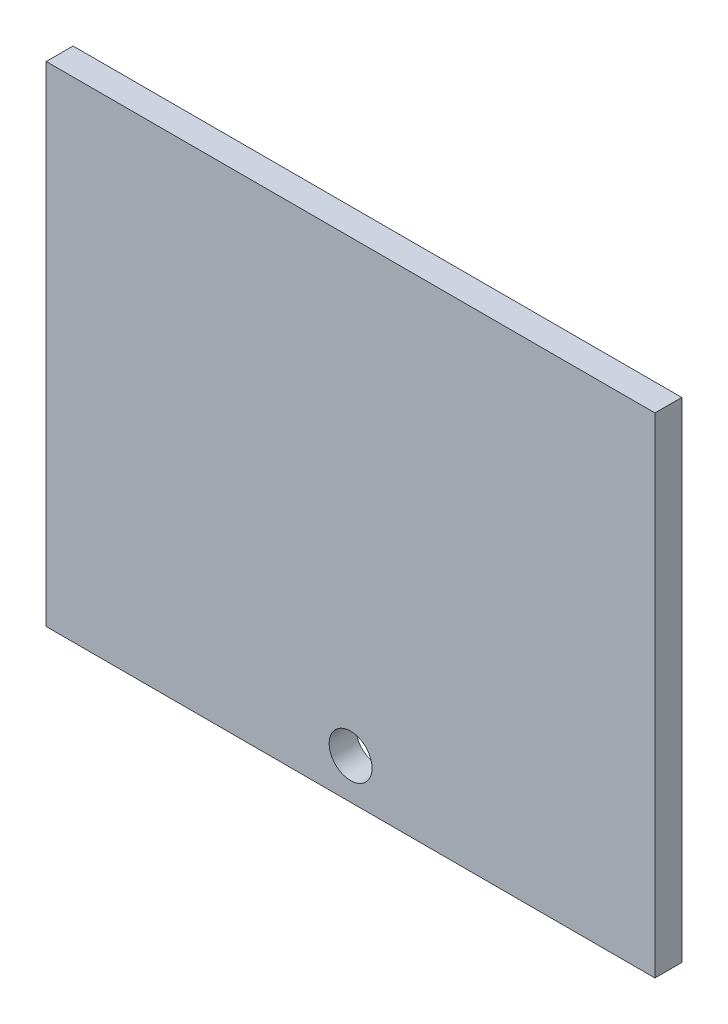
ISO-10303-21;
HEADER;
FILE_DESCRIPTION(('STEP AP214'),'2;1');
FILE_NAME('part.step','',(''),(''),'','','');
FILE_SCHEMA(('AUTOMOTIVE_DESIGN { 1 0 10303 214 1 1 1 1 }'));
ENDSEC;
DATA;
#1=APPLICATION_CONTEXT('core data for automotive mechanical design processes');
#2=APPLICATION_PROTOCOL_DEFINITION('international standard','automotive_design',2000,#1);
#3=PRODUCT_CONTEXT('',#1,'mechanical');
#4=PRODUCT('Part','Part','',(#3));
#5=PRODUCT_RELATED_PRODUCT_CATEGORY('part','',(#4));
#6=PRODUCT_DEFINITION_FORMATION('','',#4);
#7=PRODUCT_DEFINITION_CONTEXT('part definition',#1,'design');
#8=PRODUCT_DEFINITION('design','',#6,#7);
#9=PRODUCT_DEFINITION_SHAPE('','',#8);
#10=(LENGTH_UNIT() NAMED_UNIT(*) SI_UNIT(.MILLI.,.METRE.));
#11=(NAMED_UNIT(*) PLANE_ANGLE_UNIT() SI_UNIT($,.RADIAN.));
#12=(NAMED_UNIT(*) SI_UNIT($,.STERADIAN.) SOLID_ANGLE_UNIT());
#13=UNCERTAINTY_MEASURE_WITH_UNIT(LENGTH_MEASURE(1.E-05),#10,'distance_accuracy_value','');
#14=(GEOMETRIC_REPRESENTATION_CONTEXT(3) GLOBAL_UNCERTAINTY_ASSIGNED_CONTEXT((#13)) GLOBAL_UNIT_ASSIGNED_CONTEXT((#10,
#11,#12)) REPRESENTATION_CONTEXT('',''));
#15=CARTESIAN_POINT('',(0.,0.,0.));
#16=DIRECTION('',(0.,0.,1.));
#17=DIRECTION('',(1.,0.,0.));
#18=AXIS2_PLACEMENT_3D('',#15,#16,#17);
#19=CARTESIAN_POINT('',(-72.4410358565737,43.6116633484172,2.));
#20=DIRECTION('',(1.,0.,0.));
#21=DIRECTION('',(0.,0.,-1.));
#22=AXIS2_PLACEMENT_3D('',#19,#20,#21);
#23=PLANE('',#22);
#24=DIRECTION('',(0.,-1.,0.));
#25=VECTOR('',#24,1.);
#26=CARTESIAN_POINT('',(-72.4410358565737,43.6116633484172,0.));
#27=LINE('',#26,#25);
#28=CARTESIAN_POINT('',(-72.4410358565737,43.6116633484172,0.));
#29=VERTEX_POINT('',#28);
#30=CARTESIAN_POINT('',(-72.4410358565737,7.11166334841723,0.));
#31=VERTEX_POINT('',#30);
#32=EDGE_CURVE('E105',#29,#31,#27,.T.);
#33=ORIENTED_EDGE('',*,*,#32,.T.);
#34=DIRECTION('',(0.,0.,-1.));
#35=VECTOR('',#34,1.);
#36=CARTESIAN_POINT('',(-72.4410358565737,7.11166334841723,2.));
#37=LINE('',#36,#35);
#38=CARTESIAN_POINT('',(-72.4410358565737,7.11166334841723,2.));
#39=VERTEX_POINT('',#38);
#40=EDGE_CURVE('E47',#39,#31,#37,.T.);
#41=ORIENTED_EDGE('',*,*,#40,.F.);
#42=DIRECTION('',(0.,-1.,0.));
#43=VECTOR('',#42,1.);
#44=CARTESIAN_POINT('',(-72.4410358565737,43.6116633484172,2.));
#45=LINE('',#44,#43);
#46=CARTESIAN_POINT('',(-72.4410358565737,43.6116633484172,2.));
#47=VERTEX_POINT('',#46);
#48=EDGE_CURVE('E91',#47,#39,#45,.T.);
#49=ORIENTED_EDGE('',*,*,#48,.F.);
#50=DIRECTION('',(0.,0.,-1.));
#51=VECTOR('',#50,1.);
#52=CARTESIAN_POINT('',(-72.4410358565737,43.6116633484172,2.));
#53=LINE('',#52,#51);
#54=EDGE_CURVE('E101',#47,#29,#53,.T.);
#55=ORIENTED_EDGE('',*,*,#54,.T.);
#56=EDGE_LOOP('',(#33,#41,#49,#55));
#57=FACE_BOUND('',#56,.T.);
#58=ADVANCED_FACE('F39',(#57),#23,.F.);
#59=CARTESIAN_POINT('',(-72.4410358565737,7.11166334841723,2.));
#60=DIRECTION('',(0.,1.,0.));
#61=DIRECTION('',(0.,0.,1.));
#62=AXIS2_PLACEMENT_3D('',#59,#60,#61);
#63=PLANE('',#62);
#64=DIRECTION('',(1.,0.,0.));
#65=VECTOR('',#64,1.);
#66=CARTESIAN_POINT('',(-72.4410358565737,7.11166334841723,0.));
#67=LINE('',#66,#65);
#68=CARTESIAN_POINT('',(-27.0410358565737,7.11166334841723,0.));
#69=VERTEX_POINT('',#68);
#70=EDGE_CURVE('E96',#31,#69,#67,.T.);
#71=ORIENTED_EDGE('',*,*,#70,.T.);
#72=DIRECTION('',(0.,0.,-1.));
#73=VECTOR('',#72,1.);
#74=CARTESIAN_POINT('',(-27.0410358565737,7.11166334841723,2.));
#75=LINE('',#74,#73);
#76=CARTESIAN_POINT('',(-27.0410358565737,7.11166334841723,2.));
#77=VERTEX_POINT('',#76);
#78=EDGE_CURVE('E94',#77,#69,#75,.T.);
#79=ORIENTED_EDGE('',*,*,#78,.F.);
#80=DIRECTION('',(1.,0.,0.));
#81=VECTOR('',#80,1.);
#82=CARTESIAN_POINT('',(-72.4410358565737,7.11166334841723,2.));
#83=LINE('',#82,#81);
#84=EDGE_CURVE('E86',#39,#77,#83,.T.);
#85=ORIENTED_EDGE('',*,*,#84,.F.);
#86=ORIENTED_EDGE('',*,*,#40,.T.);
#87=EDGE_LOOP('',(#71,#79,#85,#86));
#88=FACE_BOUND('',#87,.T.);
#89=ADVANCED_FACE('F95',(#88),#63,.F.);
#90=CARTESIAN_POINT('',(-27.0410358565737,43.6116633484172,2.));
#91=DIRECTION('',(-1.,0.,0.));
#92=DIRECTION('',(0.,-1.,0.));
#93=AXIS2_PLACEMENT_3D('',#90,#91,#92);
#94=PLANE('',#93);
#95=DIRECTION('',(0.,1.,0.));
#96=VECTOR('',#95,1.);
#97=CARTESIAN_POINT('',(-27.0410358565737,43.6116633484172,0.));
#98=LINE('',#97,#96);
#99=CARTESIAN_POINT('',(-27.0410358565737,43.6116633484172,0.));
#100=VERTEX_POINT('',#99);
#101=EDGE_CURVE('E72',#69,#100,#98,.T.);
#102=ORIENTED_EDGE('',*,*,#101,.T.);
#103=DIRECTION('',(0.,0.,-1.));
#104=VECTOR('',#103,1.);
#105=CARTESIAN_POINT('',(-27.0410358565737,43.6116633484172,2.));
#106=LINE('',#105,#104);
#107=CARTESIAN_POINT('',(-27.0410358565737,43.6116633484172,2.));
#108=VERTEX_POINT('',#107);
#109=EDGE_CURVE('E97',#108,#100,#106,.T.);
#110=ORIENTED_EDGE('',*,*,#109,.F.);
#111=DIRECTION('',(0.,1.,0.));
#112=VECTOR('',#111,1.);
#113=CARTESIAN_POINT('',(-27.0410358565737,43.6116633484172,2.));
#114=LINE('',#113,#112);
#115=EDGE_CURVE('E89',#77,#108,#114,.T.);
#116=ORIENTED_EDGE('',*,*,#115,.F.);
#117=ORIENTED_EDGE('',*,*,#78,.T.);
#118=EDGE_LOOP('',(#102,#110,#116,#117));
#119=FACE_BOUND('',#118,.T.);
#120=ADVANCED_FACE('F99',(#119),#94,.F.);
#121=CARTESIAN_POINT('',(-72.4410358565737,43.6116633484172,2.));
#122=DIRECTION('',(0.,-1.,0.));
#123=DIRECTION('',(0.,0.,-1.));
#124=AXIS2_PLACEMENT_3D('',#121,#122,#123);
#125=PLANE('',#124);
#126=DIRECTION('',(-1.,0.,0.));
#127=VECTOR('',#126,1.);
#128=CARTESIAN_POINT('',(-72.4410358565737,43.6116633484172,0.));
#129=LINE('',#128,#127);
#130=EDGE_CURVE('E78',#100,#29,#129,.T.);
#131=ORIENTED_EDGE('',*,*,#130,.T.);
#132=ORIENTED_EDGE('',*,*,#54,.F.);
#133=DIRECTION('',(-1.,0.,0.));
#134=VECTOR('',#133,1.);
#135=CARTESIAN_POINT('',(-72.4410358565737,43.6116633484172,2.));
#136=LINE('',#135,#134);
#137=EDGE_CURVE('E55',#108,#47,#136,.T.);
#138=ORIENTED_EDGE('',*,*,#137,.F.);
#139=ORIENTED_EDGE('',*,*,#109,.T.);
#140=EDGE_LOOP('',(#131,#132,#138,#139));
#141=FACE_BOUND('',#140,.T.);
#142=ADVANCED_FACE('F128',(#141),#125,.F.);
#143=CARTESIAN_POINT('',(0.,0.,2.));
#144=DIRECTION('',(0.,0.,1.));
#145=DIRECTION('',(1.,0.,0.));
#146=AXIS2_PLACEMENT_3D('',#143,#144,#145);
#147=PLANE('',#146);
#148=CARTESIAN_POINT('',(-49.7410358565737,10.1116633484172,2.));
#149=DIRECTION('',(0.,0.,-1.));
#150=DIRECTION('',(-1.,0.,0.));
#151=AXIS2_PLACEMENT_3D('',#148,#149,#150);
#152=CIRCLE('',#151,1.6);
#153=CARTESIAN_POINT('',(-51.3410358565737,10.1116633484172,2.));
#154=VERTEX_POINT('',#153);
#155=EDGE_CURVE('E108',#154,#154,#152,.T.);
#156=ORIENTED_EDGE('',*,*,#155,.T.);
#157=EDGE_LOOP('',(#156));
#158=FACE_BOUND('',#157,.T.);
#159=ORIENTED_EDGE('',*,*,#48,.T.);
#160=ORIENTED_EDGE('',*,*,#84,.T.);
#161=ORIENTED_EDGE('',*,*,#115,.T.);
#162=ORIENTED_EDGE('',*,*,#137,.T.);
#163=EDGE_LOOP('',(#159,#160,#161,#162));
#164=FACE_BOUND('',#163,.T.);
#165=ADVANCED_FACE('F87',(#158,#164),#147,.T.);
#166=CARTESIAN_POINT('',(0.,0.,0.));
#167=DIRECTION('',(0.,0.,1.));
#168=DIRECTION('',(1.,0.,0.));
#169=AXIS2_PLACEMENT_3D('',#166,#167,#168);
#170=PLANE('',#169);
#171=CARTESIAN_POINT('',(-39.7410358565737,20.1116633484172,0.));
#172=DIRECTION('',(0.,0.,1.));
#173=DIRECTION('',(1.,0.,0.));
#174=AXIS2_PLACEMENT_3D('',#171,#172,#173);
#175=CIRCLE('',#174,2.95);
#176=CARTESIAN_POINT('',(-36.7910358565737,20.1116633484172,0.));
#177=VERTEX_POINT('',#176);
#178=EDGE_CURVE('E11',#177,#177,#175,.F.);
#179=ORIENTED_EDGE('',*,*,#178,.F.);
#180=EDGE_LOOP('',(#179));
#181=FACE_BOUND('',#180,.T.);
#182=CARTESIAN_POINT('',(-59.7410358565737,20.1116633484172,0.));
#183=DIRECTION('',(0.,0.,-1.));
#184=DIRECTION('',(-1.,0.,0.));
#185=AXIS2_PLACEMENT_3D('',#182,#183,#184);
#186=CIRCLE('',#185,2.95);
#187=CARTESIAN_POINT('',(-62.6910358565737,20.1116633484172,0.));
#188=VERTEX_POINT('',#187);
#189=EDGE_CURVE('E207',#188,#188,#186,.F.);
#190=ORIENTED_EDGE('',*,*,#189,.T.);
#191=EDGE_LOOP('',(#190));
#192=FACE_BOUND('',#191,.T.);
#193=CARTESIAN_POINT('',(-49.7410358565737,10.1116633484172,0.));
#194=DIRECTION('',(0.,0.,-1.));
#195=DIRECTION('',(-1.,0.,0.));
#196=AXIS2_PLACEMENT_3D('',#193,#194,#195);
#197=CIRCLE('',#196,1.6);
#198=CARTESIAN_POINT('',(-51.3410358565737,10.1116633484172,0.));
#199=VERTEX_POINT('',#198);
#200=EDGE_CURVE('E214',#199,#199,#197,.T.);
#201=ORIENTED_EDGE('',*,*,#200,.F.);
#202=EDGE_LOOP('',(#201));
#203=FACE_BOUND('',#202,.T.);
#204=ORIENTED_EDGE('',*,*,#32,.F.);
#205=ORIENTED_EDGE('',*,*,#130,.F.);
#206=ORIENTED_EDGE('',*,*,#101,.F.);
#207=ORIENTED_EDGE('',*,*,#70,.F.);
#208=EDGE_LOOP('',(#204,#205,#206,#207));
#209=FACE_BOUND('',#208,.T.);
#210=ADVANCED_FACE('F116',(#181,#192,#203,#209),#170,.F.);
#211=CARTESIAN_POINT('',(-49.7410358565737,10.1116633484172,2.));
#212=DIRECTION('',(0.,0.,-1.));
#213=DIRECTION('',(-1.,0.,0.));
#214=AXIS2_PLACEMENT_3D('',#211,#212,#213);
#215=CYLINDRICAL_SURFACE('',#214,1.6);
#216=ORIENTED_EDGE('',*,*,#155,.F.);
#217=EDGE_LOOP('',(#216));
#218=FACE_BOUND('',#217,.T.);
#219=ORIENTED_EDGE('',*,*,#200,.T.);
#220=EDGE_LOOP('',(#219));
#221=FACE_BOUND('',#220,.T.);
#222=ADVANCED_FACE('F118',(#218,#221),#215,.F.);
#223=CARTESIAN_POINT('',(-59.7410358565737,20.1116633484172,-1.7));
#224=DIRECTION('',(0.,0.,1.));
#225=DIRECTION('',(1.,0.,0.));
#226=AXIS2_PLACEMENT_3D('',#223,#224,#225);
#227=CYLINDRICAL_SURFACE('',#226,2.95);
#228=CARTESIAN_POINT('',(-59.7410358565737,20.1116633484172,-1.7));
#229=DIRECTION('',(0.,0.,-1.));
#230=DIRECTION('',(-1.,0.,0.));
#231=AXIS2_PLACEMENT_3D('',#228,#229,#230);
#232=CIRCLE('',#231,2.95);
#233=CARTESIAN_POINT('',(-62.6910358565737,20.1116633484172,-1.7));
#234=VERTEX_POINT('',#233);
#235=EDGE_CURVE('E210',#234,#234,#232,.F.);
#236=ORIENTED_EDGE('',*,*,#235,.T.);
#237=EDGE_LOOP('',(#236));
#238=FACE_BOUND('',#237,.T.);
#239=ORIENTED_EDGE('',*,*,#189,.F.);
#240=EDGE_LOOP('',(#239));
#241=FACE_BOUND('',#240,.T.);
#242=ADVANCED_FACE('F125',(#238,#241),#227,.T.);
#243=CARTESIAN_POINT('',(0.,0.,-1.7));
#244=DIRECTION('',(0.,0.,-1.));
#245=DIRECTION('',(-1.,0.,0.));
#246=AXIS2_PLACEMENT_3D('',#243,#244,#245);
#247=PLANE('',#246);
#248=ORIENTED_EDGE('',*,*,#235,.F.);
#249=EDGE_LOOP('',(#248));
#250=FACE_BOUND('',#249,.T.);
#251=ADVANCED_FACE('F170',(#250),#247,.T.);
#252=CARTESIAN_POINT('',(-39.7410358565737,20.1116633484172,-1.7));
#253=DIRECTION('',(0.,0.,1.));
#254=DIRECTION('',(1.,0.,0.));
#255=AXIS2_PLACEMENT_3D('',#252,#253,#254);
#256=CYLINDRICAL_SURFACE('',#255,2.95);
#257=CARTESIAN_POINT('',(-39.7410358565737,20.1116633484172,-1.7));
#258=DIRECTION('',(0.,0.,-1.));
#259=DIRECTION('',(-1.,0.,0.));
#260=AXIS2_PLACEMENT_3D('',#257,#258,#259);
#261=CIRCLE('',#260,2.95);
#262=CARTESIAN_POINT('',(-42.6910358565737,20.1116633484172,-1.7));
#263=VERTEX_POINT('',#262);
#264=EDGE_CURVE('E206',#263,#263,#261,.T.);
#265=ORIENTED_EDGE('',*,*,#264,.F.);
#266=EDGE_LOOP('',(#265));
#267=FACE_BOUND('',#266,.T.);
#268=ORIENTED_EDGE('',*,*,#178,.T.);
#269=EDGE_LOOP('',(#268));
#270=FACE_BOUND('',#269,.T.);
#271=ADVANCED_FACE('F180',(#267,#270),#256,.T.);
#272=CARTESIAN_POINT('',(-39.7410358565737,20.1116633484172,-1.7));
#273=DIRECTION('',(0.,0.,-1.));
#274=DIRECTION('',(-1.,0.,0.));
#275=AXIS2_PLACEMENT_3D('',#272,#273,#274);
#276=PLANE('',#275);
#277=ORIENTED_EDGE('',*,*,#264,.T.);
#278=EDGE_LOOP('',(#277));
#279=FACE_BOUND('',#278,.T.);
#280=ADVANCED_FACE('F190',(#279),#276,.T.);
#281=CLOSED_SHELL('',(#58,#89,#120,#142,#165,#210,#222,#242,#251,#271,#280));
#282=MANIFOLD_SOLID_BREP('B2',#281);
#283=ADVANCED_BREP_SHAPE_REPRESENTATION('',(#18,#282),#14);
#284=SHAPE_DEFINITION_REPRESENTATION(#9,#283);
ENDSEC;
END-ISO-10303-21;
